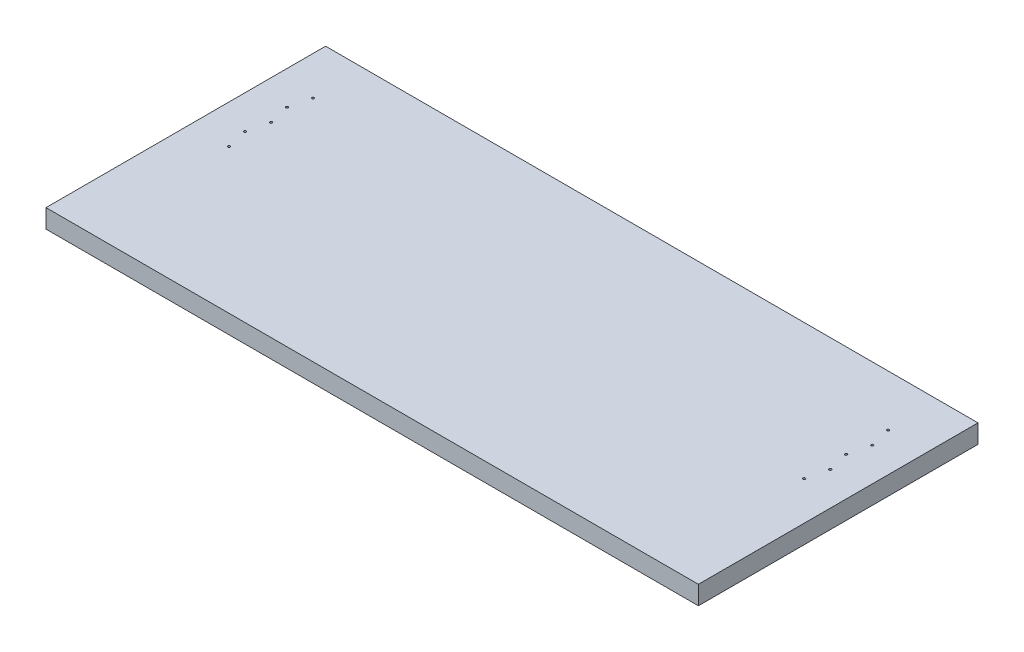
ISO-10303-21;
HEADER;
FILE_DESCRIPTION(('STEP AP214'),'2;1');
FILE_NAME('part.step','',(''),(''),'','','');
FILE_SCHEMA(('AUTOMOTIVE_DESIGN { 1 0 10303 214 1 1 1 1 }'));
ENDSEC;
DATA;
#1=APPLICATION_CONTEXT('core data for automotive mechanical design processes');
#2=APPLICATION_PROTOCOL_DEFINITION('international standard','automotive_design',2000,#1);
#3=PRODUCT_CONTEXT('',#1,'mechanical');
#4=PRODUCT('Part','Part','',(#3));
#5=PRODUCT_RELATED_PRODUCT_CATEGORY('part','',(#4));
#6=PRODUCT_DEFINITION_FORMATION('','',#4);
#7=PRODUCT_DEFINITION_CONTEXT('part definition',#1,'design');
#8=PRODUCT_DEFINITION('design','',#6,#7);
#9=PRODUCT_DEFINITION_SHAPE('','',#8);
#10=(LENGTH_UNIT() NAMED_UNIT(*) SI_UNIT(.MILLI.,.METRE.));
#11=(NAMED_UNIT(*) PLANE_ANGLE_UNIT() SI_UNIT($,.RADIAN.));
#12=(NAMED_UNIT(*) SI_UNIT($,.STERADIAN.) SOLID_ANGLE_UNIT());
#13=UNCERTAINTY_MEASURE_WITH_UNIT(LENGTH_MEASURE(1.E-05),#10,'distance_accuracy_value','');
#14=(GEOMETRIC_REPRESENTATION_CONTEXT(3) GLOBAL_UNCERTAINTY_ASSIGNED_CONTEXT((#13)) GLOBAL_UNIT_ASSIGNED_CONTEXT((#10,
#11,#12)) REPRESENTATION_CONTEXT('',''));
#15=CARTESIAN_POINT('',(0.,0.,0.));
#16=DIRECTION('',(0.,0.,1.));
#17=DIRECTION('',(1.,0.,0.));
#18=AXIS2_PLACEMENT_3D('',#15,#16,#17);
#19=CARTESIAN_POINT('',(700.,40.,300.));
#20=DIRECTION('',(-1.,0.,0.));
#21=DIRECTION('',(0.,0.,1.));
#22=AXIS2_PLACEMENT_3D('',#19,#20,#21);
#23=PLANE('',#22);
#24=DIRECTION('',(0.,0.,-1.));
#25=VECTOR('',#24,1.);
#26=CARTESIAN_POINT('',(700.,0.,300.));
#27=LINE('',#26,#25);
#28=CARTESIAN_POINT('',(700.,0.,300.));
#29=VERTEX_POINT('',#28);
#30=CARTESIAN_POINT('',(700.,0.,-300.));
#31=VERTEX_POINT('',#30);
#32=EDGE_CURVE('E111',#29,#31,#27,.T.);
#33=ORIENTED_EDGE('',*,*,#32,.T.);
#34=DIRECTION('',(0.,-1.,0.));
#35=VECTOR('',#34,1.);
#36=CARTESIAN_POINT('',(700.,40.,-300.));
#37=LINE('',#36,#35);
#38=CARTESIAN_POINT('',(700.,40.,-300.));
#39=VERTEX_POINT('',#38);
#40=EDGE_CURVE('E11',#39,#31,#37,.T.);
#41=ORIENTED_EDGE('',*,*,#40,.F.);
#42=DIRECTION('',(0.,0.,-1.));
#43=VECTOR('',#42,1.);
#44=CARTESIAN_POINT('',(700.,40.,300.));
#45=LINE('',#44,#43);
#46=CARTESIAN_POINT('',(700.,40.,300.));
#47=VERTEX_POINT('',#46);
#48=EDGE_CURVE('E95',#47,#39,#45,.T.);
#49=ORIENTED_EDGE('',*,*,#48,.F.);
#50=DIRECTION('',(0.,-1.,0.));
#51=VECTOR('',#50,1.);
#52=CARTESIAN_POINT('',(700.,40.,300.));
#53=LINE('',#52,#51);
#54=EDGE_CURVE('E107',#47,#29,#53,.T.);
#55=ORIENTED_EDGE('',*,*,#54,.T.);
#56=EDGE_LOOP('',(#33,#41,#49,#55));
#57=FACE_BOUND('',#56,.T.);
#58=ADVANCED_FACE('F43',(#57),#23,.F.);
#59=CARTESIAN_POINT('',(-700.,40.,-300.));
#60=DIRECTION('',(0.,0.,1.));
#61=DIRECTION('',(1.,0.,0.));
#62=AXIS2_PLACEMENT_3D('',#59,#60,#61);
#63=PLANE('',#62);
#64=DIRECTION('',(-1.,0.,0.));
#65=VECTOR('',#64,1.);
#66=CARTESIAN_POINT('',(-700.,0.,-300.));
#67=LINE('',#66,#65);
#68=CARTESIAN_POINT('',(-700.,0.,-300.));
#69=VERTEX_POINT('',#68);
#70=EDGE_CURVE('E100',#31,#69,#67,.T.);
#71=ORIENTED_EDGE('',*,*,#70,.T.);
#72=DIRECTION('',(0.,-1.,0.));
#73=VECTOR('',#72,1.);
#74=CARTESIAN_POINT('',(-700.,40.,-300.));
#75=LINE('',#74,#73);
#76=CARTESIAN_POINT('',(-700.,40.,-300.));
#77=VERTEX_POINT('',#76);
#78=EDGE_CURVE('E52',#77,#69,#75,.T.);
#79=ORIENTED_EDGE('',*,*,#78,.F.);
#80=DIRECTION('',(-1.,0.,0.));
#81=VECTOR('',#80,1.);
#82=CARTESIAN_POINT('',(-700.,40.,-300.));
#83=LINE('',#82,#81);
#84=EDGE_CURVE('E90',#39,#77,#83,.T.);
#85=ORIENTED_EDGE('',*,*,#84,.F.);
#86=ORIENTED_EDGE('',*,*,#40,.T.);
#87=EDGE_LOOP('',(#71,#79,#85,#86));
#88=FACE_BOUND('',#87,.T.);
#89=ADVANCED_FACE('F99',(#88),#63,.F.);
#90=CARTESIAN_POINT('',(-700.,40.,300.));
#91=DIRECTION('',(1.,0.,0.));
#92=DIRECTION('',(0.,0.,-1.));
#93=AXIS2_PLACEMENT_3D('',#90,#91,#92);
#94=PLANE('',#93);
#95=DIRECTION('',(0.,0.,1.));
#96=VECTOR('',#95,1.);
#97=CARTESIAN_POINT('',(-700.,0.,300.));
#98=LINE('',#97,#96);
#99=CARTESIAN_POINT('',(-700.,0.,300.));
#100=VERTEX_POINT('',#99);
#101=EDGE_CURVE('E77',#69,#100,#98,.T.);
#102=ORIENTED_EDGE('',*,*,#101,.T.);
#103=DIRECTION('',(0.,-1.,0.));
#104=VECTOR('',#103,1.);
#105=CARTESIAN_POINT('',(-700.,40.,300.));
#106=LINE('',#105,#104);
#107=CARTESIAN_POINT('',(-700.,40.,300.));
#108=VERTEX_POINT('',#107);
#109=EDGE_CURVE('E102',#108,#100,#106,.T.);
#110=ORIENTED_EDGE('',*,*,#109,.F.);
#111=DIRECTION('',(0.,0.,1.));
#112=VECTOR('',#111,1.);
#113=CARTESIAN_POINT('',(-700.,40.,300.));
#114=LINE('',#113,#112);
#115=EDGE_CURVE('E93',#77,#108,#114,.T.);
#116=ORIENTED_EDGE('',*,*,#115,.F.);
#117=ORIENTED_EDGE('',*,*,#78,.T.);
#118=EDGE_LOOP('',(#102,#110,#116,#117));
#119=FACE_BOUND('',#118,.T.);
#120=ADVANCED_FACE('F103',(#119),#94,.F.);
#121=CARTESIAN_POINT('',(-700.,40.,300.));
#122=DIRECTION('',(0.,0.,-1.));
#123=DIRECTION('',(-1.,0.,0.));
#124=AXIS2_PLACEMENT_3D('',#121,#122,#123);
#125=PLANE('',#124);
#126=DIRECTION('',(1.,0.,0.));
#127=VECTOR('',#126,1.);
#128=CARTESIAN_POINT('',(-700.,0.,300.));
#129=LINE('',#128,#127);
#130=EDGE_CURVE('E83',#100,#29,#129,.T.);
#131=ORIENTED_EDGE('',*,*,#130,.T.);
#132=ORIENTED_EDGE('',*,*,#54,.F.);
#133=DIRECTION('',(1.,0.,0.));
#134=VECTOR('',#133,1.);
#135=CARTESIAN_POINT('',(-700.,40.,300.));
#136=LINE('',#135,#134);
#137=EDGE_CURVE('E60',#108,#47,#136,.T.);
#138=ORIENTED_EDGE('',*,*,#137,.F.);
#139=ORIENTED_EDGE('',*,*,#109,.T.);
#140=EDGE_LOOP('',(#131,#132,#138,#139));
#141=FACE_BOUND('',#140,.T.);
#142=ADVANCED_FACE('F125',(#141),#125,.F.);
#143=CARTESIAN_POINT('',(0.,40.,0.));
#144=DIRECTION('',(0.,-1.,0.));
#145=DIRECTION('',(0.,0.,-1.));
#146=AXIS2_PLACEMENT_3D('',#143,#144,#145);
#147=PLANE('',#146);
#148=CARTESIAN_POINT('',(-617.,40.,-10.0000000000001));
#149=DIRECTION('',(0.,-1.,0.));
#150=DIRECTION('',(0.,0.,-1.));
#151=AXIS2_PLACEMENT_3D('',#148,#149,#150);
#152=CIRCLE('',#151,2.49999999999991);
#153=CARTESIAN_POINT('',(-617.,40.,-12.5));
#154=VERTEX_POINT('',#153);
#155=EDGE_CURVE('E157',#154,#154,#152,.T.);
#156=ORIENTED_EDGE('',*,*,#155,.T.);
#157=EDGE_LOOP('',(#156));
#158=FACE_BOUND('',#157,.T.);
#159=CARTESIAN_POINT('',(-628.,40.,-55.0000000000001));
#160=DIRECTION('',(0.,-1.,0.));
#161=DIRECTION('',(0.,0.,-1.));
#162=AXIS2_PLACEMENT_3D('',#159,#160,#161);
#163=CIRCLE('',#162,2.49999999999991);
#164=CARTESIAN_POINT('',(-628.,40.,-57.5));
#165=VERTEX_POINT('',#164);
#166=EDGE_CURVE('E175',#165,#165,#163,.T.);
#167=ORIENTED_EDGE('',*,*,#166,.T.);
#168=EDGE_LOOP('',(#167));
#169=FACE_BOUND('',#168,.T.);
#170=CARTESIAN_POINT('',(-617.,40.,-100.));
#171=DIRECTION('',(0.,-1.,0.));
#172=DIRECTION('',(0.,0.,-1.));
#173=AXIS2_PLACEMENT_3D('',#170,#171,#172);
#174=CIRCLE('',#173,2.50000000000003);
#175=CARTESIAN_POINT('',(-617.,40.,-102.5));
#176=VERTEX_POINT('',#175);
#177=EDGE_CURVE('E179',#176,#176,#174,.T.);
#178=ORIENTED_EDGE('',*,*,#177,.T.);
#179=EDGE_LOOP('',(#178));
#180=FACE_BOUND('',#179,.T.);
#181=CARTESIAN_POINT('',(-628.,40.,-145.));
#182=DIRECTION('',(0.,-1.,0.));
#183=DIRECTION('',(0.,0.,-1.));
#184=AXIS2_PLACEMENT_3D('',#181,#182,#183);
#185=CIRCLE('',#184,2.49999999999991);
#186=CARTESIAN_POINT('',(-628.,40.,-147.5));
#187=VERTEX_POINT('',#186);
#188=EDGE_CURVE('E183',#187,#187,#185,.T.);
#189=ORIENTED_EDGE('',*,*,#188,.T.);
#190=EDGE_LOOP('',(#189));
#191=FACE_BOUND('',#190,.T.);
#192=CARTESIAN_POINT('',(-617.,40.,-190.));
#193=DIRECTION('',(0.,-1.,0.));
#194=DIRECTION('',(0.,0.,-1.));
#195=AXIS2_PLACEMENT_3D('',#192,#193,#194);
#196=CIRCLE('',#195,2.49999999999991);
#197=CARTESIAN_POINT('',(-617.,40.,-192.5));
#198=VERTEX_POINT('',#197);
#199=EDGE_CURVE('E187',#198,#198,#196,.T.);
#200=ORIENTED_EDGE('',*,*,#199,.T.);
#201=EDGE_LOOP('',(#200));
#202=FACE_BOUND('',#201,.T.);
#203=CARTESIAN_POINT('',(617.,40.,-10.0000000000001));
#204=DIRECTION('',(0.,-1.,0.));
#205=DIRECTION('',(0.,0.,-1.));
#206=AXIS2_PLACEMENT_3D('',#203,#204,#205);
#207=CIRCLE('',#206,2.49999999999991);
#208=CARTESIAN_POINT('',(617.,40.,-12.5));
#209=VERTEX_POINT('',#208);
#210=EDGE_CURVE('E115',#209,#209,#207,.F.);
#211=ORIENTED_EDGE('',*,*,#210,.F.);
#212=EDGE_LOOP('',(#211));
#213=FACE_BOUND('',#212,.T.);
#214=CARTESIAN_POINT('',(628.,40.,-55.0000000000001));
#215=DIRECTION('',(0.,-1.,0.));
#216=DIRECTION('',(0.,0.,-1.));
#217=AXIS2_PLACEMENT_3D('',#214,#215,#216);
#218=CIRCLE('',#217,2.49999999999991);
#219=CARTESIAN_POINT('',(628.,40.,-57.5));
#220=VERTEX_POINT('',#219);
#221=EDGE_CURVE('E135',#220,#220,#218,.F.);
#222=ORIENTED_EDGE('',*,*,#221,.F.);
#223=EDGE_LOOP('',(#222));
#224=FACE_BOUND('',#223,.T.);
#225=CARTESIAN_POINT('',(617.,40.,-100.));
#226=DIRECTION('',(0.,-1.,0.));
#227=DIRECTION('',(0.,0.,-1.));
#228=AXIS2_PLACEMENT_3D('',#225,#226,#227);
#229=CIRCLE('',#228,2.50000000000003);
#230=CARTESIAN_POINT('',(617.,40.,-102.5));
#231=VERTEX_POINT('',#230);
#232=EDGE_CURVE('E139',#231,#231,#229,.F.);
#233=ORIENTED_EDGE('',*,*,#232,.F.);
#234=EDGE_LOOP('',(#233));
#235=FACE_BOUND('',#234,.T.);
#236=CARTESIAN_POINT('',(628.,40.,-145.));
#237=DIRECTION('',(0.,-1.,0.));
#238=DIRECTION('',(0.,0.,-1.));
#239=AXIS2_PLACEMENT_3D('',#236,#237,#238);
#240=CIRCLE('',#239,2.49999999999991);
#241=CARTESIAN_POINT('',(628.,40.,-147.5));
#242=VERTEX_POINT('',#241);
#243=EDGE_CURVE('E143',#242,#242,#240,.F.);
#244=ORIENTED_EDGE('',*,*,#243,.F.);
#245=EDGE_LOOP('',(#244));
#246=FACE_BOUND('',#245,.T.);
#247=CARTESIAN_POINT('',(617.,40.,-190.));
#248=DIRECTION('',(0.,-1.,0.));
#249=DIRECTION('',(0.,0.,-1.));
#250=AXIS2_PLACEMENT_3D('',#247,#248,#249);
#251=CIRCLE('',#250,2.49999999999991);
#252=CARTESIAN_POINT('',(617.,40.,-192.5));
#253=VERTEX_POINT('',#252);
#254=EDGE_CURVE('E147',#253,#253,#251,.F.);
#255=ORIENTED_EDGE('',*,*,#254,.F.);
#256=EDGE_LOOP('',(#255));
#257=FACE_BOUND('',#256,.T.);
#258=ORIENTED_EDGE('',*,*,#48,.T.);
#259=ORIENTED_EDGE('',*,*,#84,.T.);
#260=ORIENTED_EDGE('',*,*,#115,.T.);
#261=ORIENTED_EDGE('',*,*,#137,.T.);
#262=EDGE_LOOP('',(#258,#259,#260,#261));
#263=FACE_BOUND('',#262,.T.);
#264=ADVANCED_FACE('F91',(#158,#169,#180,#191,#202,#213,#224,#235,#246,#257,#263),#147,.F.);
#265=CARTESIAN_POINT('',(0.,0.,0.));
#266=DIRECTION('',(0.,-1.,0.));
#267=DIRECTION('',(0.,0.,-1.));
#268=AXIS2_PLACEMENT_3D('',#265,#266,#267);
#269=PLANE('',#268);
#270=CARTESIAN_POINT('',(-617.,0.,-10.0000000000001));
#271=DIRECTION('',(0.,-1.,0.));
#272=DIRECTION('',(0.,0.,1.));
#273=AXIS2_PLACEMENT_3D('',#270,#271,#272);
#274=CIRCLE('',#273,2.49999999999991);
#275=CARTESIAN_POINT('',(-617.,0.,-7.50000000000017));
#276=VERTEX_POINT('',#275);
#277=EDGE_CURVE('E191',#276,#276,#274,.T.);
#278=ORIENTED_EDGE('',*,*,#277,.F.);
#279=EDGE_LOOP('',(#278));
#280=FACE_BOUND('',#279,.T.);
#281=CARTESIAN_POINT('',(-628.,0.,-55.0000000000001));
#282=DIRECTION('',(0.,-1.,0.));
#283=DIRECTION('',(0.,0.,1.));
#284=AXIS2_PLACEMENT_3D('',#281,#282,#283);
#285=CIRCLE('',#284,2.49999999999991);
#286=CARTESIAN_POINT('',(-628.,0.,-52.5000000000002));
#287=VERTEX_POINT('',#286);
#288=EDGE_CURVE('E204',#287,#287,#285,.T.);
#289=ORIENTED_EDGE('',*,*,#288,.F.);
#290=EDGE_LOOP('',(#289));
#291=FACE_BOUND('',#290,.T.);
#292=CARTESIAN_POINT('',(-617.,0.,-100.));
#293=DIRECTION('',(0.,-1.,0.));
#294=DIRECTION('',(0.,0.,1.));
#295=AXIS2_PLACEMENT_3D('',#292,#293,#294);
#296=CIRCLE('',#295,2.50000000000003);
#297=CARTESIAN_POINT('',(-617.,0.,-97.5000000000001));
#298=VERTEX_POINT('',#297);
#299=EDGE_CURVE('E200',#298,#298,#296,.T.);
#300=ORIENTED_EDGE('',*,*,#299,.F.);
#301=EDGE_LOOP('',(#300));
#302=FACE_BOUND('',#301,.T.);
#303=CARTESIAN_POINT('',(-628.,0.,-145.));
#304=DIRECTION('',(0.,-1.,0.));
#305=DIRECTION('',(0.,0.,1.));
#306=AXIS2_PLACEMENT_3D('',#303,#304,#305);
#307=CIRCLE('',#306,2.49999999999991);
#308=CARTESIAN_POINT('',(-628.,0.,-142.5));
#309=VERTEX_POINT('',#308);
#310=EDGE_CURVE('E196',#309,#309,#307,.T.);
#311=ORIENTED_EDGE('',*,*,#310,.F.);
#312=EDGE_LOOP('',(#311));
#313=FACE_BOUND('',#312,.T.);
#314=CARTESIAN_POINT('',(-617.,0.,-190.));
#315=DIRECTION('',(0.,-1.,0.));
#316=DIRECTION('',(0.,0.,1.));
#317=AXIS2_PLACEMENT_3D('',#314,#315,#316);
#318=CIRCLE('',#317,2.49999999999991);
#319=CARTESIAN_POINT('',(-617.,0.,-187.5));
#320=VERTEX_POINT('',#319);
#321=EDGE_CURVE('E192',#320,#320,#318,.T.);
#322=ORIENTED_EDGE('',*,*,#321,.F.);
#323=EDGE_LOOP('',(#322));
#324=FACE_BOUND('',#323,.T.);
#325=CARTESIAN_POINT('',(617.,0.,-10.0000000000001));
#326=DIRECTION('',(0.,1.,0.));
#327=DIRECTION('',(0.,0.,1.));
#328=AXIS2_PLACEMENT_3D('',#325,#326,#327);
#329=CIRCLE('',#328,2.49999999999991);
#330=CARTESIAN_POINT('',(617.,0.,-7.50000000000017));
#331=VERTEX_POINT('',#330);
#332=EDGE_CURVE('E151',#331,#331,#329,.T.);
#333=ORIENTED_EDGE('',*,*,#332,.T.);
#334=EDGE_LOOP('',(#333));
#335=FACE_BOUND('',#334,.T.);
#336=CARTESIAN_POINT('',(628.,0.,-55.0000000000001));
#337=DIRECTION('',(0.,1.,0.));
#338=DIRECTION('',(0.,0.,1.));
#339=AXIS2_PLACEMENT_3D('',#336,#337,#338);
#340=CIRCLE('',#339,2.49999999999991);
#341=CARTESIAN_POINT('',(628.,0.,-52.5000000000002));
#342=VERTEX_POINT('',#341);
#343=EDGE_CURVE('E165',#342,#342,#340,.T.);
#344=ORIENTED_EDGE('',*,*,#343,.T.);
#345=EDGE_LOOP('',(#344));
#346=FACE_BOUND('',#345,.T.);
#347=CARTESIAN_POINT('',(617.,0.,-100.));
#348=DIRECTION('',(0.,1.,0.));
#349=DIRECTION('',(0.,0.,1.));
#350=AXIS2_PLACEMENT_3D('',#347,#348,#349);
#351=CIRCLE('',#350,2.50000000000003);
#352=CARTESIAN_POINT('',(617.,0.,-97.5000000000001));
#353=VERTEX_POINT('',#352);
#354=EDGE_CURVE('E161',#353,#353,#351,.T.);
#355=ORIENTED_EDGE('',*,*,#354,.T.);
#356=EDGE_LOOP('',(#355));
#357=FACE_BOUND('',#356,.T.);
#358=CARTESIAN_POINT('',(628.,0.,-145.));
#359=DIRECTION('',(0.,1.,0.));
#360=DIRECTION('',(0.,0.,1.));
#361=AXIS2_PLACEMENT_3D('',#358,#359,#360);
#362=CIRCLE('',#361,2.49999999999991);
#363=CARTESIAN_POINT('',(628.,0.,-142.5));
#364=VERTEX_POINT('',#363);
#365=EDGE_CURVE('E156',#364,#364,#362,.T.);
#366=ORIENTED_EDGE('',*,*,#365,.T.);
#367=EDGE_LOOP('',(#366));
#368=FACE_BOUND('',#367,.T.);
#369=CARTESIAN_POINT('',(617.,0.,-190.));
#370=DIRECTION('',(0.,1.,0.));
#371=DIRECTION('',(0.,0.,1.));
#372=AXIS2_PLACEMENT_3D('',#369,#370,#371);
#373=CIRCLE('',#372,2.49999999999991);
#374=CARTESIAN_POINT('',(617.,0.,-187.5));
#375=VERTEX_POINT('',#374);
#376=EDGE_CURVE('E152',#375,#375,#373,.T.);
#377=ORIENTED_EDGE('',*,*,#376,.T.);
#378=EDGE_LOOP('',(#377));
#379=FACE_BOUND('',#378,.T.);
#380=ORIENTED_EDGE('',*,*,#32,.F.);
#381=ORIENTED_EDGE('',*,*,#130,.F.);
#382=ORIENTED_EDGE('',*,*,#101,.F.);
#383=ORIENTED_EDGE('',*,*,#70,.F.);
#384=EDGE_LOOP('',(#380,#381,#382,#383));
#385=FACE_BOUND('',#384,.T.);
#386=ADVANCED_FACE('F128',(#280,#291,#302,#313,#324,#335,#346,#357,#368,#379,#385),#269,.T.);
#387=CARTESIAN_POINT('',(617.,70.,-190.));
#388=DIRECTION('',(0.,-1.,0.));
#389=DIRECTION('',(0.,0.,-1.));
#390=AXIS2_PLACEMENT_3D('',#387,#388,#389);
#391=CYLINDRICAL_SURFACE('',#390,2.49999999999991);
#392=ORIENTED_EDGE('',*,*,#376,.F.);
#393=EDGE_LOOP('',(#392));
#394=FACE_BOUND('',#393,.T.);
#395=ORIENTED_EDGE('',*,*,#254,.T.);
#396=EDGE_LOOP('',(#395));
#397=FACE_BOUND('',#396,.T.);
#398=ADVANCED_FACE('F217',(#394,#397),#391,.F.);
#399=CARTESIAN_POINT('',(628.,70.,-145.));
#400=DIRECTION('',(0.,-1.,0.));
#401=DIRECTION('',(0.,0.,-1.));
#402=AXIS2_PLACEMENT_3D('',#399,#400,#401);
#403=CYLINDRICAL_SURFACE('',#402,2.49999999999991);
#404=ORIENTED_EDGE('',*,*,#365,.F.);
#405=EDGE_LOOP('',(#404));
#406=FACE_BOUND('',#405,.T.);
#407=ORIENTED_EDGE('',*,*,#243,.T.);
#408=EDGE_LOOP('',(#407));
#409=FACE_BOUND('',#408,.T.);
#410=ADVANCED_FACE('F239',(#406,#409),#403,.F.);
#411=CARTESIAN_POINT('',(617.,70.,-100.));
#412=DIRECTION('',(0.,-1.,0.));
#413=DIRECTION('',(0.,0.,-1.));
#414=AXIS2_PLACEMENT_3D('',#411,#412,#413);
#415=CYLINDRICAL_SURFACE('',#414,2.50000000000003);
#416=ORIENTED_EDGE('',*,*,#354,.F.);
#417=EDGE_LOOP('',(#416));
#418=FACE_BOUND('',#417,.T.);
#419=ORIENTED_EDGE('',*,*,#232,.T.);
#420=EDGE_LOOP('',(#419));
#421=FACE_BOUND('',#420,.T.);
#422=ADVANCED_FACE('F284',(#418,#421),#415,.F.);
#423=CARTESIAN_POINT('',(628.,70.,-55.0000000000001));
#424=DIRECTION('',(0.,-1.,0.));
#425=DIRECTION('',(0.,0.,-1.));
#426=AXIS2_PLACEMENT_3D('',#423,#424,#425);
#427=CYLINDRICAL_SURFACE('',#426,2.49999999999991);
#428=ORIENTED_EDGE('',*,*,#343,.F.);
#429=EDGE_LOOP('',(#428));
#430=FACE_BOUND('',#429,.T.);
#431=ORIENTED_EDGE('',*,*,#221,.T.);
#432=EDGE_LOOP('',(#431));
#433=FACE_BOUND('',#432,.T.);
#434=ADVANCED_FACE('F295',(#430,#433),#427,.F.);
#435=CARTESIAN_POINT('',(617.,70.,-10.0000000000001));
#436=DIRECTION('',(0.,-1.,0.));
#437=DIRECTION('',(0.,0.,-1.));
#438=AXIS2_PLACEMENT_3D('',#435,#436,#437);
#439=CYLINDRICAL_SURFACE('',#438,2.49999999999991);
#440=ORIENTED_EDGE('',*,*,#332,.F.);
#441=EDGE_LOOP('',(#440));
#442=FACE_BOUND('',#441,.T.);
#443=ORIENTED_EDGE('',*,*,#210,.T.);
#444=EDGE_LOOP('',(#443));
#445=FACE_BOUND('',#444,.T.);
#446=ADVANCED_FACE('F306',(#442,#445),#439,.F.);
#447=CARTESIAN_POINT('',(-617.,70.,-190.));
#448=DIRECTION('',(0.,-1.,0.));
#449=DIRECTION('',(0.,0.,-1.));
#450=AXIS2_PLACEMENT_3D('',#447,#448,#449);
#451=CYLINDRICAL_SURFACE('',#450,2.49999999999991);
#452=ORIENTED_EDGE('',*,*,#321,.T.);
#453=EDGE_LOOP('',(#452));
#454=FACE_BOUND('',#453,.T.);
#455=ORIENTED_EDGE('',*,*,#199,.F.);
#456=EDGE_LOOP('',(#455));
#457=FACE_BOUND('',#456,.T.);
#458=ADVANCED_FACE('F316',(#454,#457),#451,.F.);
#459=CARTESIAN_POINT('',(-628.,70.,-145.));
#460=DIRECTION('',(0.,-1.,0.));
#461=DIRECTION('',(0.,0.,-1.));
#462=AXIS2_PLACEMENT_3D('',#459,#460,#461);
#463=CYLINDRICAL_SURFACE('',#462,2.49999999999991);
#464=ORIENTED_EDGE('',*,*,#310,.T.);
#465=EDGE_LOOP('',(#464));
#466=FACE_BOUND('',#465,.T.);
#467=ORIENTED_EDGE('',*,*,#188,.F.);
#468=EDGE_LOOP('',(#467));
#469=FACE_BOUND('',#468,.T.);
#470=ADVANCED_FACE('F338',(#466,#469),#463,.F.);
#471=CARTESIAN_POINT('',(-617.,70.,-100.));
#472=DIRECTION('',(0.,-1.,0.));
#473=DIRECTION('',(0.,0.,-1.));
#474=AXIS2_PLACEMENT_3D('',#471,#472,#473);
#475=CYLINDRICAL_SURFACE('',#474,2.50000000000003);
#476=ORIENTED_EDGE('',*,*,#299,.T.);
#477=EDGE_LOOP('',(#476));
#478=FACE_BOUND('',#477,.T.);
#479=ORIENTED_EDGE('',*,*,#177,.F.);
#480=EDGE_LOOP('',(#479));
#481=FACE_BOUND('',#480,.T.);
#482=ADVANCED_FACE('F349',(#478,#481),#475,.F.);
#483=CARTESIAN_POINT('',(-628.,70.,-55.0000000000001));
#484=DIRECTION('',(0.,-1.,0.));
#485=DIRECTION('',(0.,0.,-1.));
#486=AXIS2_PLACEMENT_3D('',#483,#484,#485);
#487=CYLINDRICAL_SURFACE('',#486,2.49999999999991);
#488=ORIENTED_EDGE('',*,*,#288,.T.);
#489=EDGE_LOOP('',(#488));
#490=FACE_BOUND('',#489,.T.);
#491=ORIENTED_EDGE('',*,*,#166,.F.);
#492=EDGE_LOOP('',(#491));
#493=FACE_BOUND('',#492,.T.);
#494=ADVANCED_FACE('F360',(#490,#493),#487,.F.);
#495=CARTESIAN_POINT('',(-617.,70.,-10.0000000000001));
#496=DIRECTION('',(0.,-1.,0.));
#497=DIRECTION('',(0.,0.,-1.));
#498=AXIS2_PLACEMENT_3D('',#495,#496,#497);
#499=CYLINDRICAL_SURFACE('',#498,2.49999999999991);
#500=ORIENTED_EDGE('',*,*,#277,.T.);
#501=EDGE_LOOP('',(#500));
#502=FACE_BOUND('',#501,.T.);
#503=ORIENTED_EDGE('',*,*,#155,.F.);
#504=EDGE_LOOP('',(#503));
#505=FACE_BOUND('',#504,.T.);
#506=ADVANCED_FACE('F212',(#502,#505),#499,.F.);
#507=CLOSED_SHELL('',(#58,#89,#120,#142,#264,#386,#398,#410,#422,#434,#446,#458,#470,#482,#494,#506));
#508=MANIFOLD_SOLID_BREP('B2',#507);
#509=ADVANCED_BREP_SHAPE_REPRESENTATION('',(#18,#508),#14);
#510=SHAPE_DEFINITION_REPRESENTATION(#9,#509);
ENDSEC;
END-ISO-10303-21;
